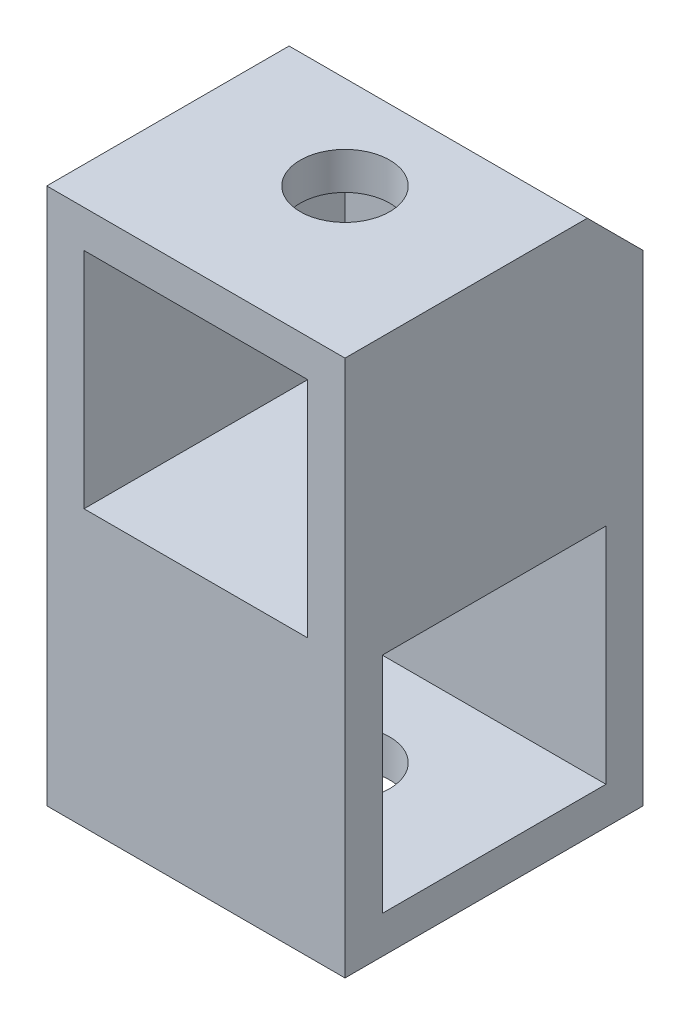
ISO-10303-21;
HEADER;
FILE_DESCRIPTION(('STEP AP214'),'2;1');
FILE_NAME('part.step','',(''),(''),'','','');
FILE_SCHEMA(('AUTOMOTIVE_DESIGN { 1 0 10303 214 1 1 1 1 }'));
ENDSEC;
DATA;
#1=APPLICATION_CONTEXT('core data for automotive mechanical design processes');
#2=APPLICATION_PROTOCOL_DEFINITION('international standard','automotive_design',2000,#1);
#3=PRODUCT_CONTEXT('',#1,'mechanical');
#4=PRODUCT('Part','Part','',(#3));
#5=PRODUCT_RELATED_PRODUCT_CATEGORY('part','',(#4));
#6=PRODUCT_DEFINITION_FORMATION('','',#4);
#7=PRODUCT_DEFINITION_CONTEXT('part definition',#1,'design');
#8=PRODUCT_DEFINITION('design','',#6,#7);
#9=PRODUCT_DEFINITION_SHAPE('','',#8);
#10=(LENGTH_UNIT() NAMED_UNIT(*) SI_UNIT(.MILLI.,.METRE.));
#11=(NAMED_UNIT(*) PLANE_ANGLE_UNIT() SI_UNIT($,.RADIAN.));
#12=(NAMED_UNIT(*) SI_UNIT($,.STERADIAN.) SOLID_ANGLE_UNIT());
#13=UNCERTAINTY_MEASURE_WITH_UNIT(LENGTH_MEASURE(1.E-05),#10,'distance_accuracy_value','');
#14=(GEOMETRIC_REPRESENTATION_CONTEXT(3) GLOBAL_UNCERTAINTY_ASSIGNED_CONTEXT((#13)) GLOBAL_UNIT_ASSIGNED_CONTEXT((#10,
#11,#12)) REPRESENTATION_CONTEXT('',''));
#15=CARTESIAN_POINT('',(0.,0.,0.));
#16=DIRECTION('',(0.,0.,1.));
#17=DIRECTION('',(1.,0.,0.));
#18=AXIS2_PLACEMENT_3D('',#15,#16,#17);
#19=CARTESIAN_POINT('',(20.,36.,20.));
#20=DIRECTION('',(-1.,0.,0.));
#21=DIRECTION('',(0.,0.,1.));
#22=AXIS2_PLACEMENT_3D('',#19,#20,#21);
#23=PLANE('',#22);
#24=DIRECTION('',(0.,0.,1.));
#25=VECTOR('',#24,1.);
#26=CARTESIAN_POINT('',(20.,-1.,15.));
#27=LINE('',#26,#25);
#28=CARTESIAN_POINT('',(20.,-1.,-15.));
#29=VERTEX_POINT('',#28);
#30=CARTESIAN_POINT('',(20.,-1.,15.));
#31=VERTEX_POINT('',#30);
#32=EDGE_CURVE('E156',#29,#31,#27,.T.);
#33=ORIENTED_EDGE('',*,*,#32,.F.);
#34=DIRECTION('',(0.,1.,0.));
#35=VECTOR('',#34,1.);
#36=CARTESIAN_POINT('',(20.,-1.,-15.));
#37=LINE('',#36,#35);
#38=CARTESIAN_POINT('',(20.,-31.,-15.));
#39=VERTEX_POINT('',#38);
#40=EDGE_CURVE('E162',#39,#29,#37,.T.);
#41=ORIENTED_EDGE('',*,*,#40,.F.);
#42=DIRECTION('',(0.,0.,-1.));
#43=VECTOR('',#42,1.);
#44=CARTESIAN_POINT('',(20.,-31.,15.));
#45=LINE('',#44,#43);
#46=CARTESIAN_POINT('',(20.,-31.,15.));
#47=VERTEX_POINT('',#46);
#48=EDGE_CURVE('E166',#47,#39,#45,.T.);
#49=ORIENTED_EDGE('',*,*,#48,.F.);
#50=DIRECTION('',(0.,-1.,0.));
#51=VECTOR('',#50,1.);
#52=CARTESIAN_POINT('',(20.,-1.,15.));
#53=LINE('',#52,#51);
#54=EDGE_CURVE('E143',#31,#47,#53,.T.);
#55=ORIENTED_EDGE('',*,*,#54,.F.);
#56=EDGE_LOOP('',(#33,#41,#49,#55));
#57=FACE_BOUND('',#56,.T.);
#58=DIRECTION('',(0.,1.,0.));
#59=VECTOR('',#58,1.);
#60=CARTESIAN_POINT('',(20.,36.,-20.));
#61=LINE('',#60,#59);
#62=CARTESIAN_POINT('',(20.,-36.,-20.));
#63=VERTEX_POINT('',#62);
#64=CARTESIAN_POINT('',(20.,28.5,-20.));
#65=VERTEX_POINT('',#64);
#66=EDGE_CURVE('E233',#63,#65,#61,.T.);
#67=ORIENTED_EDGE('',*,*,#66,.T.);
#68=DIRECTION('',(0.,-0.707106781186549,-0.707106781186546));
#69=VECTOR('',#68,1.);
#70=CARTESIAN_POINT('',(20.,36.,-12.5));
#71=LINE('',#70,#69);
#72=CARTESIAN_POINT('',(20.,36.,-12.5));
#73=VERTEX_POINT('',#72);
#74=EDGE_CURVE('E12',#65,#73,#71,.F.);
#75=ORIENTED_EDGE('',*,*,#74,.T.);
#76=DIRECTION('',(0.,0.,-1.));
#77=VECTOR('',#76,1.);
#78=CARTESIAN_POINT('',(20.,36.,20.));
#79=LINE('',#78,#77);
#80=CARTESIAN_POINT('',(20.,36.,20.));
#81=VERTEX_POINT('',#80);
#82=EDGE_CURVE('E266',#81,#73,#79,.T.);
#83=ORIENTED_EDGE('',*,*,#82,.F.);
#84=DIRECTION('',(0.,1.,0.));
#85=VECTOR('',#84,1.);
#86=CARTESIAN_POINT('',(20.,36.,20.));
#87=LINE('',#86,#85);
#88=CARTESIAN_POINT('',(20.,-36.,20.));
#89=VERTEX_POINT('',#88);
#90=EDGE_CURVE('E234',#89,#81,#87,.T.);
#91=ORIENTED_EDGE('',*,*,#90,.F.);
#92=DIRECTION('',(0.,0.,-1.));
#93=VECTOR('',#92,1.);
#94=CARTESIAN_POINT('',(20.,-36.,20.));
#95=LINE('',#94,#93);
#96=EDGE_CURVE('E248',#89,#63,#95,.T.);
#97=ORIENTED_EDGE('',*,*,#96,.T.);
#98=EDGE_LOOP('',(#67,#75,#83,#91,#97));
#99=FACE_BOUND('',#98,.T.);
#100=ADVANCED_FACE('F43',(#57,#99),#23,.F.);
#101=CARTESIAN_POINT('',(-20.,36.,20.));
#102=DIRECTION('',(0.,-1.,0.));
#103=DIRECTION('',(0.,0.,-1.));
#104=AXIS2_PLACEMENT_3D('',#101,#102,#103);
#105=PLANE('',#104);
#106=CARTESIAN_POINT('',(0.,36.,0.));
#107=DIRECTION('',(0.,1.,0.));
#108=DIRECTION('',(0.,0.,1.));
#109=AXIS2_PLACEMENT_3D('',#106,#107,#108);
#110=CIRCLE('',#109,6.);
#111=CARTESIAN_POINT('',(0.,36.,6.));
#112=VERTEX_POINT('',#111);
#113=EDGE_CURVE('E368',#112,#112,#110,.T.);
#114=ORIENTED_EDGE('',*,*,#113,.F.);
#115=EDGE_LOOP('',(#114));
#116=FACE_BOUND('',#115,.T.);
#117=ORIENTED_EDGE('',*,*,#82,.T.);
#118=DIRECTION('',(-1.,0.,0.));
#119=VECTOR('',#118,1.);
#120=CARTESIAN_POINT('',(-20.,36.,-12.5));
#121=LINE('',#120,#119);
#122=CARTESIAN_POINT('',(-20.,36.,-12.5));
#123=VERTEX_POINT('',#122);
#124=EDGE_CURVE('E270',#73,#123,#121,.T.);
#125=ORIENTED_EDGE('',*,*,#124,.T.);
#126=DIRECTION('',(0.,0.,-1.));
#127=VECTOR('',#126,1.);
#128=CARTESIAN_POINT('',(-20.,36.,20.));
#129=LINE('',#128,#127);
#130=CARTESIAN_POINT('',(-20.,36.,20.));
#131=VERTEX_POINT('',#130);
#132=EDGE_CURVE('E263',#131,#123,#129,.T.);
#133=ORIENTED_EDGE('',*,*,#132,.F.);
#134=DIRECTION('',(-1.,0.,0.));
#135=VECTOR('',#134,1.);
#136=CARTESIAN_POINT('',(-20.,36.,20.));
#137=LINE('',#136,#135);
#138=EDGE_CURVE('E238',#81,#131,#137,.T.);
#139=ORIENTED_EDGE('',*,*,#138,.F.);
#140=EDGE_LOOP('',(#117,#125,#133,#139));
#141=FACE_BOUND('',#140,.T.);
#142=ADVANCED_FACE('F279',(#116,#141),#105,.F.);
#143=CARTESIAN_POINT('',(-20.,36.,20.));
#144=DIRECTION('',(1.,0.,0.));
#145=DIRECTION('',(0.,0.,-1.));
#146=AXIS2_PLACEMENT_3D('',#143,#144,#145);
#147=PLANE('',#146);
#148=DIRECTION('',(0.,0.,-1.));
#149=VECTOR('',#148,1.);
#150=CARTESIAN_POINT('',(-20.,-31.,15.));
#151=LINE('',#150,#149);
#152=CARTESIAN_POINT('',(-20.,-31.,15.));
#153=VERTEX_POINT('',#152);
#154=CARTESIAN_POINT('',(-20.,-31.,-15.));
#155=VERTEX_POINT('',#154);
#156=EDGE_CURVE('E182',#153,#155,#151,.T.);
#157=ORIENTED_EDGE('',*,*,#156,.T.);
#158=DIRECTION('',(0.,1.,0.));
#159=VECTOR('',#158,1.);
#160=CARTESIAN_POINT('',(-20.,-1.,-15.));
#161=LINE('',#160,#159);
#162=CARTESIAN_POINT('',(-20.,-1.,-15.));
#163=VERTEX_POINT('',#162);
#164=EDGE_CURVE('E170',#155,#163,#161,.T.);
#165=ORIENTED_EDGE('',*,*,#164,.T.);
#166=DIRECTION('',(0.,0.,1.));
#167=VECTOR('',#166,1.);
#168=CARTESIAN_POINT('',(-20.,-1.,15.));
#169=LINE('',#168,#167);
#170=CARTESIAN_POINT('',(-20.,-1.,15.));
#171=VERTEX_POINT('',#170);
#172=EDGE_CURVE('E177',#163,#171,#169,.T.);
#173=ORIENTED_EDGE('',*,*,#172,.T.);
#174=DIRECTION('',(0.,-1.,0.));
#175=VECTOR('',#174,1.);
#176=CARTESIAN_POINT('',(-20.,-1.,15.));
#177=LINE('',#176,#175);
#178=EDGE_CURVE('E146',#171,#153,#177,.T.);
#179=ORIENTED_EDGE('',*,*,#178,.T.);
#180=EDGE_LOOP('',(#157,#165,#173,#179));
#181=FACE_BOUND('',#180,.T.);
#182=ORIENTED_EDGE('',*,*,#132,.T.);
#183=DIRECTION('',(0.,0.707106781186549,0.707106781186546));
#184=VECTOR('',#183,1.);
#185=CARTESIAN_POINT('',(-20.,36.,-12.5));
#186=LINE('',#185,#184);
#187=CARTESIAN_POINT('',(-20.,28.5,-20.));
#188=VERTEX_POINT('',#187);
#189=EDGE_CURVE('E67',#123,#188,#186,.F.);
#190=ORIENTED_EDGE('',*,*,#189,.T.);
#191=DIRECTION('',(0.,-1.,0.));
#192=VECTOR('',#191,1.);
#193=CARTESIAN_POINT('',(-20.,36.,-20.));
#194=LINE('',#193,#192);
#195=CARTESIAN_POINT('',(-20.,-36.,-20.));
#196=VERTEX_POINT('',#195);
#197=EDGE_CURVE('E251',#188,#196,#194,.T.);
#198=ORIENTED_EDGE('',*,*,#197,.T.);
#199=DIRECTION('',(0.,0.,-1.));
#200=VECTOR('',#199,1.);
#201=CARTESIAN_POINT('',(-20.,-36.,20.));
#202=LINE('',#201,#200);
#203=CARTESIAN_POINT('',(-20.,-36.,20.));
#204=VERTEX_POINT('',#203);
#205=EDGE_CURVE('E259',#204,#196,#202,.T.);
#206=ORIENTED_EDGE('',*,*,#205,.F.);
#207=DIRECTION('',(0.,-1.,0.));
#208=VECTOR('',#207,1.);
#209=CARTESIAN_POINT('',(-20.,36.,20.));
#210=LINE('',#209,#208);
#211=EDGE_CURVE('E242',#131,#204,#210,.T.);
#212=ORIENTED_EDGE('',*,*,#211,.F.);
#213=EDGE_LOOP('',(#182,#190,#198,#206,#212));
#214=FACE_BOUND('',#213,.T.);
#215=ADVANCED_FACE('F284',(#181,#214),#147,.F.);
#216=CARTESIAN_POINT('',(-20.,-36.,20.));
#217=DIRECTION('',(0.,1.,0.));
#218=DIRECTION('',(0.,0.,1.));
#219=AXIS2_PLACEMENT_3D('',#216,#217,#218);
#220=PLANE('',#219);
#221=CARTESIAN_POINT('',(0.,-36.,0.));
#222=DIRECTION('',(0.,1.,0.));
#223=DIRECTION('',(0.,0.,1.));
#224=AXIS2_PLACEMENT_3D('',#221,#222,#223);
#225=CIRCLE('',#224,6.);
#226=CARTESIAN_POINT('',(0.,-36.,6.));
#227=VERTEX_POINT('',#226);
#228=EDGE_CURVE('E374',#227,#227,#225,.T.);
#229=ORIENTED_EDGE('',*,*,#228,.T.);
#230=EDGE_LOOP('',(#229));
#231=FACE_BOUND('',#230,.T.);
#232=DIRECTION('',(1.,0.,0.));
#233=VECTOR('',#232,1.);
#234=CARTESIAN_POINT('',(-20.,-36.,-20.));
#235=LINE('',#234,#233);
#236=EDGE_CURVE('E239',#196,#63,#235,.T.);
#237=ORIENTED_EDGE('',*,*,#236,.T.);
#238=ORIENTED_EDGE('',*,*,#96,.F.);
#239=DIRECTION('',(1.,0.,0.));
#240=VECTOR('',#239,1.);
#241=CARTESIAN_POINT('',(-20.,-36.,20.));
#242=LINE('',#241,#240);
#243=EDGE_CURVE('E245',#204,#89,#242,.T.);
#244=ORIENTED_EDGE('',*,*,#243,.F.);
#245=ORIENTED_EDGE('',*,*,#205,.T.);
#246=EDGE_LOOP('',(#237,#238,#244,#245));
#247=FACE_BOUND('',#246,.T.);
#248=ADVANCED_FACE('F310',(#231,#247),#220,.F.);
#249=CARTESIAN_POINT('',(0.,0.,20.));
#250=DIRECTION('',(0.,0.,1.));
#251=DIRECTION('',(1.,0.,0.));
#252=AXIS2_PLACEMENT_3D('',#249,#250,#251);
#253=PLANE('',#252);
#254=DIRECTION('',(0.,1.,0.));
#255=VECTOR('',#254,1.);
#256=CARTESIAN_POINT('',(15.,31.,20.));
#257=LINE('',#256,#255);
#258=CARTESIAN_POINT('',(15.,1.,20.));
#259=VERTEX_POINT('',#258);
#260=CARTESIAN_POINT('',(15.,31.,20.));
#261=VERTEX_POINT('',#260);
#262=EDGE_CURVE('E189',#259,#261,#257,.T.);
#263=ORIENTED_EDGE('',*,*,#262,.F.);
#264=DIRECTION('',(1.,0.,0.));
#265=VECTOR('',#264,1.);
#266=CARTESIAN_POINT('',(-15.,1.,20.));
#267=LINE('',#266,#265);
#268=CARTESIAN_POINT('',(-15.,1.,20.));
#269=VERTEX_POINT('',#268);
#270=EDGE_CURVE('E215',#269,#259,#267,.T.);
#271=ORIENTED_EDGE('',*,*,#270,.F.);
#272=DIRECTION('',(0.,-1.,0.));
#273=VECTOR('',#272,1.);
#274=CARTESIAN_POINT('',(-15.,31.,20.));
#275=LINE('',#274,#273);
#276=CARTESIAN_POINT('',(-15.,31.,20.));
#277=VERTEX_POINT('',#276);
#278=EDGE_CURVE('E211',#277,#269,#275,.T.);
#279=ORIENTED_EDGE('',*,*,#278,.F.);
#280=DIRECTION('',(-1.,0.,0.));
#281=VECTOR('',#280,1.);
#282=CARTESIAN_POINT('',(-15.,31.,20.));
#283=LINE('',#282,#281);
#284=EDGE_CURVE('E207',#261,#277,#283,.T.);
#285=ORIENTED_EDGE('',*,*,#284,.F.);
#286=EDGE_LOOP('',(#263,#271,#279,#285));
#287=FACE_BOUND('',#286,.T.);
#288=ORIENTED_EDGE('',*,*,#90,.T.);
#289=ORIENTED_EDGE('',*,*,#138,.T.);
#290=ORIENTED_EDGE('',*,*,#211,.T.);
#291=ORIENTED_EDGE('',*,*,#243,.T.);
#292=EDGE_LOOP('',(#288,#289,#290,#291));
#293=FACE_BOUND('',#292,.T.);
#294=ADVANCED_FACE('F288',(#287,#293),#253,.T.);
#295=CARTESIAN_POINT('',(0.,0.,-20.));
#296=DIRECTION('',(0.,0.,1.));
#297=DIRECTION('',(1.,0.,0.));
#298=AXIS2_PLACEMENT_3D('',#295,#296,#297);
#299=PLANE('',#298);
#300=ORIENTED_EDGE('',*,*,#197,.F.);
#301=DIRECTION('',(1.,0.,0.));
#302=VECTOR('',#301,1.);
#303=CARTESIAN_POINT('',(0.,28.5,-20.));
#304=LINE('',#303,#302);
#305=EDGE_CURVE('E53',#188,#65,#304,.T.);
#306=ORIENTED_EDGE('',*,*,#305,.T.);
#307=ORIENTED_EDGE('',*,*,#66,.F.);
#308=ORIENTED_EDGE('',*,*,#236,.F.);
#309=EDGE_LOOP('',(#300,#306,#307,#308));
#310=FACE_BOUND('',#309,.T.);
#311=ADVANCED_FACE('F315',(#310),#299,.F.);
#312=CARTESIAN_POINT('',(15.,31.,-62.4264068711928));
#313=DIRECTION('',(1.,0.,0.));
#314=DIRECTION('',(0.,0.,-1.));
#315=AXIS2_PLACEMENT_3D('',#312,#313,#314);
#316=PLANE('',#315);
#317=DIRECTION('',(0.,-1.,0.));
#318=VECTOR('',#317,1.);
#319=CARTESIAN_POINT('',(15.,31.,-15.));
#320=LINE('',#319,#318);
#321=CARTESIAN_POINT('',(15.,31.,-15.));
#322=VERTEX_POINT('',#321);
#323=CARTESIAN_POINT('',(15.,1.,-15.));
#324=VERTEX_POINT('',#323);
#325=EDGE_CURVE('E201',#322,#324,#320,.T.);
#326=ORIENTED_EDGE('',*,*,#325,.T.);
#327=DIRECTION('',(0.,0.,1.));
#328=VECTOR('',#327,1.);
#329=CARTESIAN_POINT('',(15.,1.,-62.4264068711928));
#330=LINE('',#329,#328);
#331=EDGE_CURVE('E198',#324,#259,#330,.T.);
#332=ORIENTED_EDGE('',*,*,#331,.T.);
#333=ORIENTED_EDGE('',*,*,#262,.T.);
#334=DIRECTION('',(0.,0.,1.));
#335=VECTOR('',#334,1.);
#336=CARTESIAN_POINT('',(15.,31.,-62.4264068711928));
#337=LINE('',#336,#335);
#338=EDGE_CURVE('E219',#322,#261,#337,.T.);
#339=ORIENTED_EDGE('',*,*,#338,.F.);
#340=EDGE_LOOP('',(#326,#332,#333,#339));
#341=FACE_BOUND('',#340,.T.);
#342=ADVANCED_FACE('F318',(#341),#316,.F.);
#343=CARTESIAN_POINT('',(-15.,1.,-62.4264068711928));
#344=DIRECTION('',(0.,-1.,0.));
#345=DIRECTION('',(0.,0.,-1.));
#346=AXIS2_PLACEMENT_3D('',#343,#344,#345);
#347=PLANE('',#346);
#348=DIRECTION('',(-1.,0.,0.));
#349=VECTOR('',#348,1.);
#350=CARTESIAN_POINT('',(-15.,1.,-15.));
#351=LINE('',#350,#349);
#352=CARTESIAN_POINT('',(-15.,1.,-15.));
#353=VERTEX_POINT('',#352);
#354=EDGE_CURVE('E197',#324,#353,#351,.T.);
#355=ORIENTED_EDGE('',*,*,#354,.T.);
#356=DIRECTION('',(0.,0.,1.));
#357=VECTOR('',#356,1.);
#358=CARTESIAN_POINT('',(-15.,1.,-62.4264068711928));
#359=LINE('',#358,#357);
#360=EDGE_CURVE('E222',#353,#269,#359,.T.);
#361=ORIENTED_EDGE('',*,*,#360,.T.);
#362=ORIENTED_EDGE('',*,*,#270,.T.);
#363=ORIENTED_EDGE('',*,*,#331,.F.);
#364=EDGE_LOOP('',(#355,#361,#362,#363));
#365=FACE_BOUND('',#364,.T.);
#366=CARTESIAN_POINT('',(0.,1.,0.));
#367=DIRECTION('',(0.,1.,0.));
#368=DIRECTION('',(0.,0.,1.));
#369=AXIS2_PLACEMENT_3D('',#366,#367,#368);
#370=CIRCLE('',#369,2.5);
#371=CARTESIAN_POINT('',(0.,1.,2.5));
#372=VERTEX_POINT('',#371);
#373=EDGE_CURVE('E361',#372,#372,#370,.T.);
#374=ORIENTED_EDGE('',*,*,#373,.F.);
#375=EDGE_LOOP('',(#374));
#376=FACE_BOUND('',#375,.T.);
#377=ADVANCED_FACE('F324',(#365,#376),#347,.F.);
#378=CARTESIAN_POINT('',(-15.,31.,-62.4264068711928));
#379=DIRECTION('',(-1.,0.,0.));
#380=DIRECTION('',(0.,0.,1.));
#381=AXIS2_PLACEMENT_3D('',#378,#379,#380);
#382=PLANE('',#381);
#383=DIRECTION('',(0.,1.,0.));
#384=VECTOR('',#383,1.);
#385=CARTESIAN_POINT('',(-15.,31.,-15.));
#386=LINE('',#385,#384);
#387=CARTESIAN_POINT('',(-15.,31.,-15.));
#388=VERTEX_POINT('',#387);
#389=EDGE_CURVE('E194',#353,#388,#386,.T.);
#390=ORIENTED_EDGE('',*,*,#389,.T.);
#391=DIRECTION('',(0.,0.,1.));
#392=VECTOR('',#391,1.);
#393=CARTESIAN_POINT('',(-15.,31.,-62.4264068711928));
#394=LINE('',#393,#392);
#395=EDGE_CURVE('E225',#388,#277,#394,.T.);
#396=ORIENTED_EDGE('',*,*,#395,.T.);
#397=ORIENTED_EDGE('',*,*,#278,.T.);
#398=ORIENTED_EDGE('',*,*,#360,.F.);
#399=EDGE_LOOP('',(#390,#396,#397,#398));
#400=FACE_BOUND('',#399,.T.);
#401=ADVANCED_FACE('F330',(#400),#382,.F.);
#402=CARTESIAN_POINT('',(-15.,31.,-62.4264068711928));
#403=DIRECTION('',(0.,1.,0.));
#404=DIRECTION('',(0.,0.,1.));
#405=AXIS2_PLACEMENT_3D('',#402,#403,#404);
#406=PLANE('',#405);
#407=CARTESIAN_POINT('',(0.,31.,0.));
#408=DIRECTION('',(0.,1.,0.));
#409=DIRECTION('',(0.,0.,1.));
#410=AXIS2_PLACEMENT_3D('',#407,#408,#409);
#411=CIRCLE('',#410,6.);
#412=CARTESIAN_POINT('',(0.,31.,6.));
#413=VERTEX_POINT('',#412);
#414=EDGE_CURVE('E382',#413,#413,#411,.T.);
#415=ORIENTED_EDGE('',*,*,#414,.T.);
#416=EDGE_LOOP('',(#415));
#417=FACE_BOUND('',#416,.T.);
#418=DIRECTION('',(1.,0.,0.));
#419=VECTOR('',#418,1.);
#420=CARTESIAN_POINT('',(-15.,31.,-15.));
#421=LINE('',#420,#419);
#422=EDGE_CURVE('E204',#388,#322,#421,.T.);
#423=ORIENTED_EDGE('',*,*,#422,.T.);
#424=ORIENTED_EDGE('',*,*,#338,.T.);
#425=ORIENTED_EDGE('',*,*,#284,.T.);
#426=ORIENTED_EDGE('',*,*,#395,.F.);
#427=EDGE_LOOP('',(#423,#424,#425,#426));
#428=FACE_BOUND('',#427,.T.);
#429=ADVANCED_FACE('F326',(#417,#428),#406,.F.);
#430=CARTESIAN_POINT('',(0.,0.,-15.));
#431=DIRECTION('',(0.,0.,1.));
#432=DIRECTION('',(1.,0.,0.));
#433=AXIS2_PLACEMENT_3D('',#430,#431,#432);
#434=PLANE('',#433);
#435=ORIENTED_EDGE('',*,*,#325,.F.);
#436=ORIENTED_EDGE('',*,*,#422,.F.);
#437=ORIENTED_EDGE('',*,*,#389,.F.);
#438=ORIENTED_EDGE('',*,*,#354,.F.);
#439=EDGE_LOOP('',(#435,#436,#437,#438));
#440=FACE_BOUND('',#439,.T.);
#441=ADVANCED_FACE('F329',(#440),#434,.T.);
#442=CARTESIAN_POINT('',(-20.,-1.,-15.));
#443=DIRECTION('',(0.,0.,-1.));
#444=DIRECTION('',(-1.,0.,0.));
#445=AXIS2_PLACEMENT_3D('',#442,#443,#444);
#446=PLANE('',#445);
#447=DIRECTION('',(1.,0.,0.));
#448=VECTOR('',#447,1.);
#449=CARTESIAN_POINT('',(-20.,-1.,-15.));
#450=LINE('',#449,#448);
#451=EDGE_CURVE('E152',#163,#29,#450,.T.);
#452=ORIENTED_EDGE('',*,*,#451,.F.);
#453=ORIENTED_EDGE('',*,*,#164,.F.);
#454=DIRECTION('',(1.,0.,0.));
#455=VECTOR('',#454,1.);
#456=CARTESIAN_POINT('',(-20.,-31.,-15.));
#457=LINE('',#456,#455);
#458=EDGE_CURVE('E186',#155,#39,#457,.T.);
#459=ORIENTED_EDGE('',*,*,#458,.T.);
#460=ORIENTED_EDGE('',*,*,#40,.T.);
#461=EDGE_LOOP('',(#452,#453,#459,#460));
#462=FACE_BOUND('',#461,.T.);
#463=ADVANCED_FACE('F340',(#462),#446,.F.);
#464=CARTESIAN_POINT('',(-20.,-31.,15.));
#465=DIRECTION('',(0.,-1.,0.));
#466=DIRECTION('',(0.,0.,-1.));
#467=AXIS2_PLACEMENT_3D('',#464,#465,#466);
#468=PLANE('',#467);
#469=CARTESIAN_POINT('',(0.,-31.,0.));
#470=DIRECTION('',(0.,-1.,0.));
#471=DIRECTION('',(0.,0.,-1.));
#472=AXIS2_PLACEMENT_3D('',#469,#470,#471);
#473=CIRCLE('',#472,6.);
#474=CARTESIAN_POINT('',(0.,-31.,-6.));
#475=VERTEX_POINT('',#474);
#476=EDGE_CURVE('E378',#475,#475,#473,.T.);
#477=ORIENTED_EDGE('',*,*,#476,.T.);
#478=EDGE_LOOP('',(#477));
#479=FACE_BOUND('',#478,.T.);
#480=ORIENTED_EDGE('',*,*,#458,.F.);
#481=ORIENTED_EDGE('',*,*,#156,.F.);
#482=DIRECTION('',(1.,0.,0.));
#483=VECTOR('',#482,1.);
#484=CARTESIAN_POINT('',(-20.,-31.,15.));
#485=LINE('',#484,#483);
#486=EDGE_CURVE('E151',#153,#47,#485,.T.);
#487=ORIENTED_EDGE('',*,*,#486,.T.);
#488=ORIENTED_EDGE('',*,*,#48,.T.);
#489=EDGE_LOOP('',(#480,#481,#487,#488));
#490=FACE_BOUND('',#489,.T.);
#491=ADVANCED_FACE('F343',(#479,#490),#468,.F.);
#492=CARTESIAN_POINT('',(-20.,-1.,15.));
#493=DIRECTION('',(0.,0.,1.));
#494=DIRECTION('',(0.,-1.,0.));
#495=AXIS2_PLACEMENT_3D('',#492,#493,#494);
#496=PLANE('',#495);
#497=ORIENTED_EDGE('',*,*,#486,.F.);
#498=ORIENTED_EDGE('',*,*,#178,.F.);
#499=DIRECTION('',(1.,0.,0.));
#500=VECTOR('',#499,1.);
#501=CARTESIAN_POINT('',(-20.,-1.,15.));
#502=LINE('',#501,#500);
#503=EDGE_CURVE('E139',#171,#31,#502,.T.);
#504=ORIENTED_EDGE('',*,*,#503,.T.);
#505=ORIENTED_EDGE('',*,*,#54,.T.);
#506=EDGE_LOOP('',(#497,#498,#504,#505));
#507=FACE_BOUND('',#506,.T.);
#508=ADVANCED_FACE('F141',(#507),#496,.F.);
#509=CARTESIAN_POINT('',(-20.,-1.,15.));
#510=DIRECTION('',(0.,1.,0.));
#511=DIRECTION('',(0.,0.,1.));
#512=AXIS2_PLACEMENT_3D('',#509,#510,#511);
#513=PLANE('',#512);
#514=ORIENTED_EDGE('',*,*,#503,.F.);
#515=ORIENTED_EDGE('',*,*,#172,.F.);
#516=ORIENTED_EDGE('',*,*,#451,.T.);
#517=ORIENTED_EDGE('',*,*,#32,.T.);
#518=EDGE_LOOP('',(#514,#515,#516,#517));
#519=FACE_BOUND('',#518,.T.);
#520=CARTESIAN_POINT('',(0.,-1.,0.));
#521=DIRECTION('',(0.,1.,0.));
#522=DIRECTION('',(0.,0.,1.));
#523=AXIS2_PLACEMENT_3D('',#520,#521,#522);
#524=CIRCLE('',#523,2.5);
#525=CARTESIAN_POINT('',(0.,-1.,2.5));
#526=VERTEX_POINT('',#525);
#527=EDGE_CURVE('E364',#526,#526,#524,.T.);
#528=ORIENTED_EDGE('',*,*,#527,.T.);
#529=EDGE_LOOP('',(#528));
#530=FACE_BOUND('',#529,.T.);
#531=ADVANCED_FACE('F157',(#519,#530),#513,.F.);
#532=CARTESIAN_POINT('',(-20.,36.,-12.5));
#533=DIRECTION('',(0.,-0.707106781186545,0.707106781186549));
#534=DIRECTION('',(-1.,0.,0.));
#535=AXIS2_PLACEMENT_3D('',#532,#533,#534);
#536=PLANE('',#535);
#537=ORIENTED_EDGE('',*,*,#74,.F.);
#538=ORIENTED_EDGE('',*,*,#305,.F.);
#539=ORIENTED_EDGE('',*,*,#189,.F.);
#540=ORIENTED_EDGE('',*,*,#124,.F.);
#541=EDGE_LOOP('',(#537,#538,#539,#540));
#542=FACE_BOUND('',#541,.T.);
#543=ADVANCED_FACE('F46',(#542),#536,.F.);
#544=CARTESIAN_POINT('',(0.,-36.,0.));
#545=DIRECTION('',(0.,1.,0.));
#546=DIRECTION('',(0.,0.,1.));
#547=AXIS2_PLACEMENT_3D('',#544,#545,#546);
#548=CYLINDRICAL_SURFACE('',#547,6.);
#549=ORIENTED_EDGE('',*,*,#228,.F.);
#550=EDGE_LOOP('',(#549));
#551=FACE_BOUND('',#550,.T.);
#552=ORIENTED_EDGE('',*,*,#476,.F.);
#553=EDGE_LOOP('',(#552));
#554=FACE_BOUND('',#553,.T.);
#555=ADVANCED_FACE('F292',(#551,#554),#548,.F.);
#556=ORIENTED_EDGE('',*,*,#113,.T.);
#557=EDGE_LOOP('',(#556));
#558=FACE_BOUND('',#557,.T.);
#559=ORIENTED_EDGE('',*,*,#414,.F.);
#560=EDGE_LOOP('',(#559));
#561=FACE_BOUND('',#560,.T.);
#562=ADVANCED_FACE('F297',(#558,#561),#548,.F.);
#563=CARTESIAN_POINT('',(0.,1.,0.));
#564=DIRECTION('',(0.,-1.,0.));
#565=DIRECTION('',(0.,0.,-1.));
#566=AXIS2_PLACEMENT_3D('',#563,#564,#565);
#567=CYLINDRICAL_SURFACE('',#566,2.5);
#568=ORIENTED_EDGE('',*,*,#373,.T.);
#569=EDGE_LOOP('',(#568));
#570=FACE_BOUND('',#569,.T.);
#571=ORIENTED_EDGE('',*,*,#527,.F.);
#572=EDGE_LOOP('',(#571));
#573=FACE_BOUND('',#572,.T.);
#574=ADVANCED_FACE('F352',(#570,#573),#567,.F.);
#575=CLOSED_SHELL('',(#100,#142,#215,#248,#294,#311,#342,#377,#401,#429,#441,#463,#491,#508,
#531,#543,#555,#562,#574));
#576=MANIFOLD_SOLID_BREP('B2',#575);
#577=ADVANCED_BREP_SHAPE_REPRESENTATION('',(#18,#576),#14);
#578=SHAPE_DEFINITION_REPRESENTATION(#9,#577);
ENDSEC;
END-ISO-10303-21;
